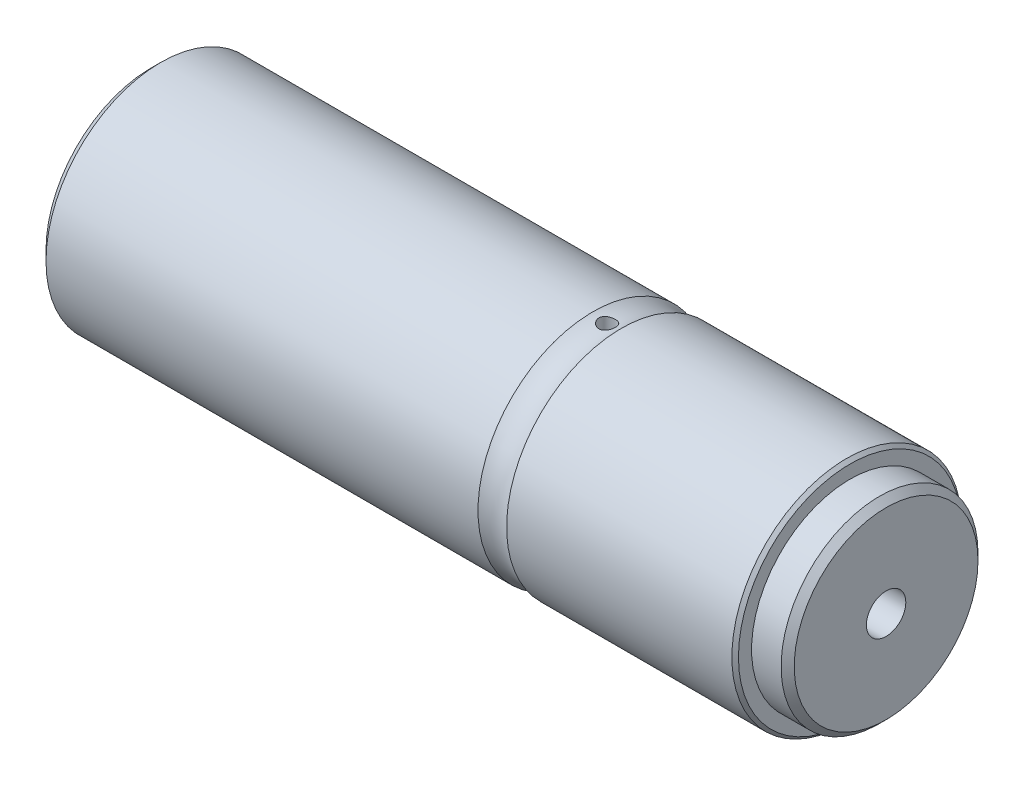
ISO-10303-21;
HEADER;
FILE_DESCRIPTION(('STEP AP214'),'2;1');
FILE_NAME('part.step','',(''),(''),'','','');
FILE_SCHEMA(('AUTOMOTIVE_DESIGN { 1 0 10303 214 1 1 1 1 }'));
ENDSEC;
DATA;
#1=APPLICATION_CONTEXT('core data for automotive mechanical design processes');
#2=APPLICATION_PROTOCOL_DEFINITION('international standard','automotive_design',2000,#1);
#3=PRODUCT_CONTEXT('',#1,'mechanical');
#4=PRODUCT('Part','Part','',(#3));
#5=PRODUCT_RELATED_PRODUCT_CATEGORY('part','',(#4));
#6=PRODUCT_DEFINITION_FORMATION('','',#4);
#7=PRODUCT_DEFINITION_CONTEXT('part definition',#1,'design');
#8=PRODUCT_DEFINITION('design','',#6,#7);
#9=PRODUCT_DEFINITION_SHAPE('','',#8);
#10=(LENGTH_UNIT() NAMED_UNIT(*) SI_UNIT(.MILLI.,.METRE.));
#11=(NAMED_UNIT(*) PLANE_ANGLE_UNIT() SI_UNIT($,.RADIAN.));
#12=(NAMED_UNIT(*) SI_UNIT($,.STERADIAN.) SOLID_ANGLE_UNIT());
#13=UNCERTAINTY_MEASURE_WITH_UNIT(LENGTH_MEASURE(1.E-05),#10,'distance_accuracy_value','');
#14=(GEOMETRIC_REPRESENTATION_CONTEXT(3) GLOBAL_UNCERTAINTY_ASSIGNED_CONTEXT((#13)) GLOBAL_UNIT_ASSIGNED_CONTEXT((#10,
#11,#12)) REPRESENTATION_CONTEXT('',''));
#15=CARTESIAN_POINT('',(0.,0.,0.));
#16=DIRECTION('',(0.,0.,1.));
#17=DIRECTION('',(1.,0.,0.));
#18=AXIS2_PLACEMENT_3D('',#15,#16,#17);
#19=CARTESIAN_POINT('',(-85.,-50.,0.));
#20=DIRECTION('',(0.,1.,0.));
#21=DIRECTION('',(0.,0.,1.));
#22=AXIS2_PLACEMENT_3D('',#19,#20,#21);
#23=CYLINDRICAL_SURFACE('',#22,2.49999999999999);
#24=CARTESIAN_POINT('',(-85.,-3.12249899919918,2.5));
#25=CARTESIAN_POINT('',(-84.9378432485545,-3.12249991555419,2.4999994109714));
#26=CARTESIAN_POINT('',(-84.8756740533292,-3.12436490733914,2.49767581942174));
#27=CARTESIAN_POINT('',(-84.7518828204523,-3.13172923119023,2.48843349840857));
#28=CARTESIAN_POINT('',(-84.6902611267429,-3.13723070381362,2.48151206248434));
#29=CARTESIAN_POINT('',(-84.5067739522563,-3.15888953558502,2.45397595058366));
#30=CARTESIAN_POINT('',(-84.386451668811,-3.1802003627114,2.4265899094646));
#31=CARTESIAN_POINT('',(-84.1544018021218,-3.23299770760365,2.35576217141198));
#32=CARTESIAN_POINT('',(-84.0426095849449,-3.26439575383207,2.31245961359202));
#33=CARTESIAN_POINT('',(-83.827991474666,-3.33366000884437,2.211439164309));
#34=CARTESIAN_POINT('',(-83.7251658262469,-3.37152639405532,2.15372087963018));
#35=CARTESIAN_POINT('',(-83.5162660186964,-3.45559225121873,2.01647682425579));
#36=CARTESIAN_POINT('',(-83.4116066749955,-3.50222814511575,1.9350642566695));
#37=CARTESIAN_POINT('',(-83.2162384483762,-3.59505503533365,1.75662526657433));
#38=CARTESIAN_POINT('',(-83.1255417200464,-3.64124561158436,1.65958538899783));
#39=CARTESIAN_POINT('',(-82.9497797018273,-3.73459524771312,1.43833990582856));
#40=CARTESIAN_POINT('',(-82.8667138155496,-3.78119887781502,1.31226934259653));
#41=CARTESIAN_POINT('',(-82.7594548452638,-3.84307251838772,1.1116339554343));
#42=CARTESIAN_POINT('',(-82.7265848616669,-3.8623628309205,1.04281240974105));
#43=CARTESIAN_POINT('',(-82.6670453146367,-3.89770436975434,0.901758767615559));
#44=CARTESIAN_POINT('',(-82.6403714689616,-3.91375783207116,0.829529068393806));
#45=CARTESIAN_POINT('',(-82.5960161847437,-3.94066759113821,0.689700297916585));
#46=CARTESIAN_POINT('',(-82.5776980234819,-3.95188535984464,0.622371981278598));
#47=CARTESIAN_POINT('',(-82.5466977136867,-3.9709624190916,0.485997575898819));
#48=CARTESIAN_POINT('',(-82.5340123107838,-3.97882364879719,0.416952503441693));
#49=CARTESIAN_POINT('',(-82.5144862023655,-3.99095470334735,0.277765449857186));
#50=CARTESIAN_POINT('',(-82.5076418834866,-3.99522674847832,0.207624174243918));
#51=CARTESIAN_POINT('',(-82.4999007866108,-4.00006125072436,0.0669114466599529));
#52=CARTESIAN_POINT('',(-82.4990033240367,-4.00062413482247,-0.00365995486026464));
#53=CARTESIAN_POINT('',(-82.5047253735473,-3.99704479619501,-0.196045081555524));
#54=CARTESIAN_POINT('',(-82.5173065030789,-3.98917040897434,-0.317681845488523));
#55=CARTESIAN_POINT('',(-82.5597302179661,-3.96290903275929,-0.55663649462024));
#56=CARTESIAN_POINT('',(-82.5895741079736,-3.94452124920476,-0.673954052677409));
#57=CARTESIAN_POINT('',(-82.6652085592833,-3.89876170711608,-0.901771991763851));
#58=CARTESIAN_POINT('',(-82.7110399195711,-3.87136697381046,-1.01225407159605));
#59=CARTESIAN_POINT('',(-82.8169372389843,-3.80971291751353,-1.22404012071222));
#60=CARTESIAN_POINT('',(-82.8770064410637,-3.77545203089317,-1.32534199174243));
#61=CARTESIAN_POINT('',(-83.0180564169237,-3.69786441247166,-1.52942649744657));
#62=CARTESIAN_POINT('',(-83.1007092766905,-3.6539400638152,-1.63082454612905));
#63=CARTESIAN_POINT('',(-83.2802647372071,-3.56390927740506,-1.81919733573061));
#64=CARTESIAN_POINT('',(-83.377188046384,-3.51779973570408,-1.90615071842623));
#65=CARTESIAN_POINT('',(-83.5974112531735,-3.42142883464465,-2.07470887167907));
#66=CARTESIAN_POINT('',(-83.7225027633581,-3.37141162686596,-2.15413229677841));
#67=CARTESIAN_POINT('',(-83.9872922373014,-3.28028278192382,-2.29052307550561));
#68=CARTESIAN_POINT('',(-84.1269626874531,-3.2391548038693,-2.34753179448502));
#69=CARTESIAN_POINT('',(-84.3795388061062,-3.18183753131763,-2.42437133527929));
#70=CARTESIAN_POINT('',(-84.4898219252135,-3.16193408602512,-2.45003683445402));
#71=CARTESIAN_POINT('',(-84.7142303775599,-3.13358277759547,-2.48620337073089));
#72=CARTESIAN_POINT('',(-84.8283502426568,-3.12511926504438,-2.49672512520809));
#73=CARTESIAN_POINT('',(-85.0574573605025,-3.12092267030677,-2.50197072095179));
#74=CARTESIAN_POINT('',(-85.1724460004784,-3.12521876170185,-2.49665835896693));
#75=CARTESIAN_POINT('',(-85.3995611643185,-3.14592085836187,-2.47051466367813));
#76=CARTESIAN_POINT('',(-85.5116852383712,-3.16233689222905,-2.44967047849125));
#77=CARTESIAN_POINT('',(-85.7284367594257,-3.20460120797142,-2.39409874195037));
#78=CARTESIAN_POINT('',(-85.8331573158943,-3.23028954367816,-2.35960571424756));
#79=CARTESIAN_POINT('',(-86.0355746998938,-3.28831148388748,-2.27804893702241));
#80=CARTESIAN_POINT('',(-86.133269018878,-3.3206474460208,-2.23098072583745));
#81=CARTESIAN_POINT('',(-86.3386119416632,-3.39574401285202,-2.11530798730693));
#82=CARTESIAN_POINT('',(-86.4446145273018,-3.43931724293015,-2.04430931160542));
#83=CARTESIAN_POINT('',(-86.6443706606543,-3.52787943213337,-1.88737868921488));
#84=CARTESIAN_POINT('',(-86.7381113212423,-3.57286982004466,-1.80143124902619));
#85=CARTESIAN_POINT('',(-86.925964070641,-3.66766209459503,-1.6007693249212));
#86=CARTESIAN_POINT('',(-87.0177273984849,-3.71707933883199,-1.48365201617176));
#87=CARTESIAN_POINT('',(-87.1801470147197,-3.80768973398605,-1.23256787407809));
#88=CARTESIAN_POINT('',(-87.2508131951269,-3.84888673619007,-1.09860897940974));
#89=CARTESIAN_POINT('',(-87.336581067975,-3.89988966499775,-0.891930804655081));
#90=CARTESIAN_POINT('',(-87.3612974439513,-3.91477055097243,-0.824318196039421));
#91=CARTESIAN_POINT('',(-87.4049382767323,-3.94124643918617,-0.686640792876425));
#92=CARTESIAN_POINT('',(-87.4238660861509,-3.95284334314803,-0.616577444051138));
#93=CARTESIAN_POINT('',(-87.4556058301392,-3.97238512039948,-0.474639231464266));
#94=CARTESIAN_POINT('',(-87.4684230995164,-3.98033317908834,-0.40276600575551));
#95=CARTESIAN_POINT('',(-87.4877391722929,-3.99234168343341,-0.257881807142462));
#96=CARTESIAN_POINT('',(-87.4942390209308,-3.99640277220023,-0.184871024482534));
#97=CARTESIAN_POINT('',(-87.5030715155071,-4.00191521492704,0.0131102774248955));
#98=CARTESIAN_POINT('',(-87.4992657929094,-3.99952706123945,0.138539079205453));
#99=CARTESIAN_POINT('',(-87.4730824104545,-3.98321975018361,0.386583137102135));
#100=CARTESIAN_POINT('',(-87.4507055933212,-3.96930111604855,0.509198520626834));
#101=CARTESIAN_POINT('',(-87.3896775844539,-3.93192083384283,0.744080605483851));
#102=CARTESIAN_POINT('',(-87.3516179264353,-3.90880701054801,0.856558752631812));
#103=CARTESIAN_POINT('',(-87.2608805375565,-3.85489971248842,1.07343034721918));
#104=CARTESIAN_POINT('',(-87.2082003404328,-3.82410494215307,1.17782242685802));
#105=CARTESIAN_POINT('',(-87.0836787212801,-3.75350673935647,1.38731297754797));
#106=CARTESIAN_POINT('',(-87.0104160092425,-3.71310001864656,1.49136012183779));
#107=CARTESIAN_POINT('',(-86.8498467674859,-3.62867283985204,1.68643334934802));
#108=CARTESIAN_POINT('',(-86.7625243911657,-3.58464833191202,1.77744451843681));
#109=CARTESIAN_POINT('',(-86.5617674849381,-3.49000828219717,1.95744716561589));
#110=CARTESIAN_POINT('',(-86.4463833874286,-3.43935738427102,2.04425661250063));
#111=CARTESIAN_POINT('',(-86.2007105902403,-3.3434964745711,2.19754648509904));
#112=CARTESIAN_POINT('',(-86.0704301888475,-3.29828346204188,2.26403815415027));
#113=CARTESIAN_POINT('',(-85.8271946992151,-3.22859539780089,2.3619822941284));
#114=CARTESIAN_POINT('',(-85.7167294278465,-3.20174639338767,2.39792458576829));
#115=CARTESIAN_POINT('',(-85.4900606569983,-3.15878358104508,2.45425618419745));
#116=CARTESIAN_POINT('',(-85.3738765802003,-3.14263581150427,2.47469472410168));
#117=CARTESIAN_POINT('',(-85.213940005354,-3.12952857640605,2.49119847139522));
#118=CARTESIAN_POINT('',(-85.1712744742914,-3.12689994306768,2.4944943383796));
#119=CARTESIAN_POINT('',(-85.0857413010483,-3.1233846193986,2.49889558125807));
#120=CARTESIAN_POINT('',(-85.0428736107567,-3.12249836712869,2.50000040629188));
#121=CARTESIAN_POINT('',(-85.,-3.12249899919918,2.5));
#122=B_SPLINE_CURVE_WITH_KNOTS('',3,(#24,#25,#26,#27,#28,#29,#30,#31,#32,#33,#34,#35,#36,#37,
#38,#39,#40,#41,#42,#43,#44,#45,#46,#47,#48,#49,#50,#51,#52,#53,#54,#55,#56,#57,#58,#59,#60,#61,
#62,#63,#64,#65,#66,#67,#68,#69,#70,#71,#72,#73,#74,#75,#76,#77,#78,#79,#80,#81,#82,#83,#84,#85,
#86,#87,#88,#89,#90,#91,#92,#93,#94,#95,#96,#97,#98,#99,#100,#101,#102,#103,#104,#105,#106,#107,
#108,#109,#110,#111,#112,#113,#114,#115,#116,#117,#118,#119,#120,#121),.UNSPECIFIED.,.T.,.F.,(4,
2,2,2,2,2,2,2,2,2,2,2,2,2,2,2,2,2,2,2,2,2,2,2,2,2,2,2,2,2,2,2,2,2,2,2,2,2,2,2,2,2,2,2,2,2,2,2,
4),(0.,0.186415315858449,0.372940459994487,0.746478880764682,1.11682668423132,1.48718459072605,
1.90722798685068,2.32763499192877,2.79876029265969,3.03445880867313,3.26999394209508,
3.48170145743205,3.69328649746503,3.90474055342594,4.11617026725866,4.48184709708113,
4.84755156693918,5.21419620193003,5.58092442797433,5.99329080205306,6.40626158573463,
6.87316206383501,7.33919680735484,7.68265621505464,8.02564530559506,8.36941921026405,
8.71347788865087,9.05186495232123,9.39037223519197,9.79332737765185,10.1967026751544,
10.6647326786671,11.1325428866818,11.3527929661038,11.5729152387446,11.7928449800803,
12.0127383271001,12.3871595324234,12.7615637480925,13.1229788842093,13.4844550226785,
13.8834503840958,14.2828986410982,14.7399238503459,15.1966956936286,15.5530255473291,
15.9082190611886,16.0367696833384,16.1653526209168),.UNSPECIFIED.);
#123=CARTESIAN_POINT('',(-85.,-3.12249899919918,2.5));
#124=VERTEX_POINT('',#123);
#125=EDGE_CURVE('E63',#124,#124,#122,.T.);
#126=ORIENTED_EDGE('',*,*,#125,.T.);
#127=EDGE_LOOP('',(#126));
#128=FACE_BOUND('',#127,.T.);
#129=CARTESIAN_POINT('',(-86.752396524481,-34.1081703536473,-1.78300498261505));
#130=CARTESIAN_POINT('',(-86.653067586052,-34.0853642041606,-1.88062742103635));
#131=CARTESIAN_POINT('',(-86.5455509224049,-34.0626600453764,-1.96995872305671));
#132=CARTESIAN_POINT('',(-86.3167783428665,-34.0199030161531,-2.12968408787526));
#133=CARTESIAN_POINT('',(-86.1955224408048,-33.9998501430455,-2.20007816973481));
#134=CARTESIAN_POINT('',(-85.9421174303636,-33.964578568251,-2.31993242926557));
#135=CARTESIAN_POINT('',(-85.8099494589765,-33.9493684680192,-2.36935541048342));
#136=CARTESIAN_POINT('',(-85.5386324546151,-33.925599513647,-2.44534362794854));
#137=CARTESIAN_POINT('',(-85.399485503669,-33.9170386882559,-2.47191563886807));
#138=CARTESIAN_POINT('',(-85.1230225967033,-33.9077457140911,-2.50071004288863));
#139=CARTESIAN_POINT('',(-84.9857942489072,-33.906768033013,-2.5036961757501));
#140=CARTESIAN_POINT('',(-84.7128476307024,-33.9121055666187,-2.48721388993134));
#141=CARTESIAN_POINT('',(-84.5771292453423,-33.9184202222582,-2.4677471925272));
#142=CARTESIAN_POINT('',(-84.3137787433715,-33.9374307822718,-2.40769348329728));
#143=CARTESIAN_POINT('',(-84.1860399660545,-33.949998447497,-2.36753035364206));
#144=CARTESIAN_POINT('',(-83.9390904397141,-33.9801180545722,-2.26764645068462));
#145=CARTESIAN_POINT('',(-83.8198811019028,-33.9976708188398,-2.20792245007401));
#146=CARTESIAN_POINT('',(-83.5890979643006,-34.0366134827962,-2.06836442791297));
#147=CARTESIAN_POINT('',(-83.4779019447045,-34.0581101973214,-1.98793601104856));
#148=CARTESIAN_POINT('',(-83.2702378197435,-34.1022878484109,-1.8101431104858));
#149=CARTESIAN_POINT('',(-83.1737737704275,-34.1249691088095,-1.71277397834874));
#150=CARTESIAN_POINT('',(-82.9945204651826,-34.1700126423905,-1.49939942930707));
#151=CARTESIAN_POINT('',(-82.9123989363277,-34.1923291851213,-1.38282175834132));
#152=CARTESIAN_POINT('',(-82.7689199451465,-34.2331340460333,-1.13689913852018));
#153=CARTESIAN_POINT('',(-82.7075602863158,-34.2516227690988,-1.00755554210873));
#154=CARTESIAN_POINT('',(-82.6083241239408,-34.2823220845045,-0.741462791805835));
#155=CARTESIAN_POINT('',(-82.5701379985504,-34.2946150633358,-0.604839078976484));
#156=CARTESIAN_POINT('',(-82.5173983591676,-34.3117537359683,-0.326665604025611));
#157=CARTESIAN_POINT('',(-82.5028363490877,-34.3166021070863,-0.185117631561379));
#158=CARTESIAN_POINT('',(-82.4980288131039,-34.3181947449711,0.0918827933370042));
#159=CARTESIAN_POINT('',(-82.5066934161375,-34.315302249972,0.227315481999155));
#160=CARTESIAN_POINT('',(-82.5457074795901,-34.3025285339949,0.494670046610562));
#161=CARTESIAN_POINT('',(-82.5760568576453,-34.2926473395615,0.62659193589267));
#162=CARTESIAN_POINT('',(-82.6571174956942,-34.2671167405513,0.882505088511226));
#163=CARTESIAN_POINT('',(-82.7077034956673,-34.2515028679328,1.00653979644676));
#164=CARTESIAN_POINT('',(-82.8276858983488,-34.2161888371144,1.24451598725644));
#165=CARTESIAN_POINT('',(-82.8970865798727,-34.1964877496439,1.35845516638569));
#166=CARTESIAN_POINT('',(-83.0562189138961,-34.1541241038181,1.57825999808723));
#167=CARTESIAN_POINT('',(-83.1466954336118,-34.1313707215904,1.68356911189599));
#168=CARTESIAN_POINT('',(-83.3438337608463,-34.0860449495929,1.87783716479805));
#169=CARTESIAN_POINT('',(-83.4504990774158,-34.063472600183,1.96679254982375));
#170=CARTESIAN_POINT('',(-83.6806300495383,-34.0203142723232,2.12827698594614));
#171=CARTESIAN_POINT('',(-83.8044824531678,-33.9998015982332,2.20027642946643));
#172=CARTESIAN_POINT('',(-84.0632711463569,-33.9638773613633,2.32228095475745));
#173=CARTESIAN_POINT('',(-84.1982048256409,-33.9484646015388,2.37229119870952));
#174=CARTESIAN_POINT('',(-84.4712911125599,-33.9249294961242,2.44743657135788));
#175=CARTESIAN_POINT('',(-84.6092427328265,-33.9166120996942,2.47323930915251));
#176=CARTESIAN_POINT('',(-84.8877496379488,-33.9075240874527,2.50139468052883));
#177=CARTESIAN_POINT('',(-85.0283042074701,-33.9067514281732,2.50375366378043));
#178=CARTESIAN_POINT('',(-85.3020635397748,-33.9127157857845,2.48532314791767));
#179=CARTESIAN_POINT('',(-85.4353380091543,-33.9191548089474,2.46545224680755));
#180=CARTESIAN_POINT('',(-85.696538065598,-33.9383543709154,2.40474862707048));
#181=CARTESIAN_POINT('',(-85.8244633402965,-33.9511152783289,2.36391468615217));
#182=CARTESIAN_POINT('',(-86.0727441249074,-33.9817422018178,2.26216414836144));
#183=CARTESIAN_POINT('',(-86.1930209780655,-33.9996532126501,2.2010697880859));
#184=CARTESIAN_POINT('',(-86.4218574293505,-34.0386821021557,2.06066822822823));
#185=CARTESIAN_POINT('',(-86.530414015903,-34.0598008017197,1.98135636387376));
#186=CARTESIAN_POINT('',(-86.7378482424947,-34.1040950189323,1.80262262911865));
#187=CARTESIAN_POINT('',(-86.8360805163259,-34.1273202417781,1.70246313411299));
#188=CARTESIAN_POINT('',(-87.0145827028685,-34.1724422306469,1.48695574291819));
#189=CARTESIAN_POINT('',(-87.094849991118,-34.1943388022303,1.37160563147263));
#190=CARTESIAN_POINT('',(-87.2362573382882,-34.2346638318538,1.12669653222244));
#191=CARTESIAN_POINT('',(-87.2970838625169,-34.2530336996208,0.996946114165817));
#192=CARTESIAN_POINT('',(-87.3958288079155,-34.2836350211506,0.728327973873629));
#193=CARTESIAN_POINT('',(-87.4337550094042,-34.2958685594742,0.589463365955095));
#194=CARTESIAN_POINT('',(-87.4842529928595,-34.3123032605442,0.312328347973635));
#195=CARTESIAN_POINT('',(-87.4977527051526,-34.3167980653974,0.174244514878348));
#196=CARTESIAN_POINT('',(-87.5017293353196,-34.3181137434551,-0.102276952719838));
#197=CARTESIAN_POINT('',(-87.4922106172401,-34.3149360712789,-0.240714515188538));
#198=CARTESIAN_POINT('',(-87.4512233285856,-34.3015314468107,-0.509272435464886));
#199=CARTESIAN_POINT('',(-87.4204818211337,-34.2915381224121,-0.639516764320789));
#200=CARTESIAN_POINT('',(-87.3388841701878,-34.2658780744014,-0.892943793844475));
#201=CARTESIAN_POINT('',(-87.2880254081461,-34.2502106122417,-1.01612557282984));
#202=CARTESIAN_POINT('',(-87.1666160626764,-34.2145501312499,-1.25459579461915));
#203=CARTESIAN_POINT('',(-87.0957185510069,-34.1944824442458,-1.36969602660149));
#204=CARTESIAN_POINT('',(-86.9365594488903,-34.152301913875,-1.58677723312002));
#205=CARTESIAN_POINT('',(-86.8482938677215,-34.1301886010977,-1.68875518358029));
#206=CARTESIAN_POINT('',(-86.752396524481,-34.1081703536473,-1.78300498261505));
#207=B_SPLINE_CURVE_WITH_KNOTS('',3,(#129,#130,#131,#132,#133,#134,#135,#136,#137,#138,#139,
#140,#141,#142,#143,#144,#145,#146,#147,#148,#149,#150,#151,#152,#153,#154,#155,#156,#157,#158,
#159,#160,#161,#162,#163,#164,#165,#166,#167,#168,#169,#170,#171,#172,#173,#174,#175,#176,#177,
#178,#179,#180,#181,#182,#183,#184,#185,#186,#187,#188,#189,#190,#191,#192,#193,#194,#195,#196,
#197,#198,#199,#200,#201,#202,#203,#204,#205,#206),.UNSPECIFIED.,.T.,.F.,(4,2,2,2,2,2,2,2,2,2,2,
2,2,2,2,2,2,2,2,2,2,2,2,2,2,2,2,2,2,2,2,2,2,2,2,2,2,2,4),(0.,0.42291264623028,0.845824866773706,
1.26948410276424,1.69301769232097,2.10277813000338,2.5125071567695,2.91415970800312,
3.31587856048639,3.73074998178015,4.1457354215564,4.57666364305437,5.00754626018539,
5.43253726300112,5.85737538975028,6.26263165079054,6.66788637258209,7.07067054100775,
7.4735463871443,7.89371665732941,8.31397813318541,8.74600554054653,9.17793147099349,
9.59756145228199,10.0170777749626,10.419878617711,10.8227029492246,11.2291595092274,
11.6357202627108,12.0603663244647,12.4850743813182,12.9163217461479,13.3474225133669,
13.7617720529783,14.1760430425357,14.5767834358178,14.9775760083523,15.3857840526525,
15.794086002092),.UNSPECIFIED.);
#208=CARTESIAN_POINT('',(-86.752396524481,-34.1081703536473,-1.78300498261505));
#209=VERTEX_POINT('',#208);
#210=EDGE_CURVE('E74',#209,#209,#207,.T.);
#211=ORIENTED_EDGE('',*,*,#210,.T.);
#212=EDGE_LOOP('',(#211));
#213=FACE_BOUND('',#212,.T.);
#214=ADVANCED_FACE('F38',(#128,#213),#23,.F.);
#215=CARTESIAN_POINT('',(-224.,35.,0.));
#216=DIRECTION('',(-1.,0.,0.));
#217=DIRECTION('',(0.,0.,1.));
#218=AXIS2_PLACEMENT_3D('',#215,#216,#217);
#219=PLANE('',#218);
#220=CARTESIAN_POINT('',(-224.,0.,0.));
#221=DIRECTION('',(-1.,0.,0.));
#222=DIRECTION('',(0.,0.,1.));
#223=AXIS2_PLACEMENT_3D('',#220,#221,#222);
#224=CIRCLE('',#223,32.);
#225=CARTESIAN_POINT('',(-224.,0.,32.));
#226=VERTEX_POINT('',#225);
#227=EDGE_CURVE('E83',#226,#226,#224,.T.);
#228=ORIENTED_EDGE('',*,*,#227,.T.);
#229=EDGE_LOOP('',(#228));
#230=FACE_BOUND('',#229,.T.);
#231=ADVANCED_FACE('F142',(#230),#219,.T.);
#232=CARTESIAN_POINT('',(0.,0.,0.));
#233=DIRECTION('',(1.,0.,0.));
#234=DIRECTION('',(0.,0.,-1.));
#235=AXIS2_PLACEMENT_3D('',#232,#233,#234);
#236=CYLINDRICAL_SURFACE('',#235,35.);
#237=CARTESIAN_POINT('',(-221.,0.,0.));
#238=DIRECTION('',(-1.,0.,0.));
#239=DIRECTION('',(0.,0.,1.));
#240=AXIS2_PLACEMENT_3D('',#237,#238,#239);
#241=CIRCLE('',#240,35.);
#242=CARTESIAN_POINT('',(-221.,0.,35.));
#243=VERTEX_POINT('',#242);
#244=EDGE_CURVE('E80',#243,#243,#241,.F.);
#245=ORIENTED_EDGE('',*,*,#244,.T.);
#246=EDGE_LOOP('',(#245));
#247=FACE_BOUND('',#246,.T.);
#248=CARTESIAN_POINT('',(-89.3588989435407,0.,0.));
#249=DIRECTION('',(1.,0.,0.));
#250=DIRECTION('',(0.,0.,-1.));
#251=AXIS2_PLACEMENT_3D('',#248,#249,#250);
#252=CIRCLE('',#251,35.);
#253=CARTESIAN_POINT('',(-89.3588989435407,0.,-35.));
#254=VERTEX_POINT('',#253);
#255=EDGE_CURVE('E77',#254,#254,#252,.T.);
#256=ORIENTED_EDGE('',*,*,#255,.F.);
#257=EDGE_LOOP('',(#256));
#258=FACE_BOUND('',#257,.T.);
#259=ADVANCED_FACE('F147',(#247,#258),#236,.T.);
#260=CARTESIAN_POINT('',(-85.,0.,0.));
#261=DIRECTION('',(1.,0.,0.));
#262=DIRECTION('',(0.,0.,-1.));
#263=AXIS2_PLACEMENT_3D('',#260,#261,#262);
#264=TOROIDAL_SURFACE('',#263,44.,10.);
#265=ORIENTED_EDGE('',*,*,#210,.F.);
#266=EDGE_LOOP('',(#265));
#267=FACE_BOUND('',#266,.T.);
#268=CARTESIAN_POINT('',(-86.752396524481,34.1081703536473,-1.78300498261505));
#269=CARTESIAN_POINT('',(-86.8519795821211,34.1310352424582,-1.68513013997717));
#270=CARTESIAN_POINT('',(-86.9433486733167,34.1540059912927,-1.57890578091366));
#271=CARTESIAN_POINT('',(-87.1072788197374,34.1976529072119,-1.35237668797553));
#272=CARTESIAN_POINT('',(-87.179838827174,34.2183289464296,-1.23207117023031));
#273=CARTESIAN_POINT('',(-87.3041231755078,34.2550714166454,-0.98018667882236));
#274=CARTESIAN_POINT('',(-87.3558109306437,34.2711297394581,-0.848588395927944));
#275=CARTESIAN_POINT('',(-87.4363599195915,34.2966401613018,-0.577980408089227));
#276=CARTESIAN_POINT('',(-87.4652288589723,34.3060944902762,-0.438973221959665));
#277=CARTESIAN_POINT('',(-87.4984707300894,34.3170170583494,-0.162448719553676));
#278=CARTESIAN_POINT('',(-87.5036258235058,34.318740247615,-0.0250354040390488));
#279=CARTESIAN_POINT('',(-87.4913709444467,34.3146875756419,0.248658499425027));
#280=CARTESIAN_POINT('',(-87.4739630238126,34.3089123962917,0.38493918923931));
#281=CARTESIAN_POINT('',(-87.4179253397142,34.2907837116161,0.649197244065423));
#282=CARTESIAN_POINT('',(-87.3798058829189,34.2785886016057,0.777294645595358));
#283=CARTESIAN_POINT('',(-87.2839570275322,34.2490746990763,1.02529114096496));
#284=CARTESIAN_POINT('',(-87.2262242899403,34.2317550342086,1.14518883469361));
#285=CARTESIAN_POINT('',(-87.0906114112488,34.193183314753,1.37769610958868));
#286=CARTESIAN_POINT('',(-87.012133065048,34.171820999606,1.48993813005131));
#287=CARTESIAN_POINT('',(-86.8380848858574,34.1278289175317,1.7000182545097));
#288=CARTESIAN_POINT('',(-86.7425104342639,34.1051988092409,1.79785245310096));
#289=CARTESIAN_POINT('',(-86.5324039174785,34.06012117802,1.98037007547032));
#290=CARTESIAN_POINT('',(-86.4172643778168,34.0377175360961,2.06436704997883));
#291=CARTESIAN_POINT('',(-86.1739034380001,33.9965920717882,2.21182861340204));
#292=CARTESIAN_POINT('',(-86.0456831823951,33.9778699276956,2.27529499670053));
#293=CARTESIAN_POINT('',(-85.7812579763116,33.9464754305325,2.3789814399346));
#294=CARTESIAN_POINT('',(-85.6451686322504,33.9337325056471,2.41947391673497));
#295=CARTESIAN_POINT('',(-85.3676468713891,33.915485592202,2.47687214600041));
#296=CARTESIAN_POINT('',(-85.2262162866099,33.9099791443502,2.49378591172947));
#297=CARTESIAN_POINT('',(-84.9487945137859,33.9069405739899,2.50315419862596));
#298=CARTESIAN_POINT('',(-84.8128417012692,33.9090641207953,2.49666482001524));
#299=CARTESIAN_POINT('',(-84.5440776102787,33.9202813192204,2.46180744755648));
#300=CARTESIAN_POINT('',(-84.4112662344939,33.9293747546444,2.43344013232959));
#301=CARTESIAN_POINT('',(-84.1535935838464,33.9534216844053,2.35617090024048));
#302=CARTESIAN_POINT('',(-84.0286742758655,33.968324655351,2.307445772325));
#303=CARTESIAN_POINT('',(-83.7886691110593,34.0024362852183,2.19099952725368));
#304=CARTESIAN_POINT('',(-83.6735853104215,34.0216458414379,2.12327445062653));
#305=CARTESIAN_POINT('',(-83.4515983489348,34.0632556789205,1.96762504199518));
#306=CARTESIAN_POINT('',(-83.3451995470516,34.0857521830423,1.87900707829082));
#307=CARTESIAN_POINT('',(-83.1484499017031,34.1309463816153,1.68547125875876));
#308=CARTESIAN_POINT('',(-83.058102976698,34.1536441237754,1.58054943464441));
#309=CARTESIAN_POINT('',(-82.8932524411168,34.1974866755426,1.35347419185023));
#310=CARTESIAN_POINT('',(-82.8193219448116,34.2185622009267,1.23088985815797));
#311=CARTESIAN_POINT('',(-82.6932389087483,34.2558666261381,0.974306258332475));
#312=CARTESIAN_POINT('',(-82.6410816157447,34.2720965835669,0.840309491313458));
#313=CARTESIAN_POINT('',(-82.5614195145919,34.2973618802443,0.568242283658947));
#314=CARTESIAN_POINT('',(-82.5333214021625,34.3065697179736,0.43036215008549));
#315=CARTESIAN_POINT('',(-82.5006578104043,34.3173046400563,0.151563572604622));
#316=CARTESIAN_POINT('',(-82.4960851299696,34.3188340747559,0.0106460716960703));
#317=CARTESIAN_POINT('',(-82.5103213122804,34.3141297258023,-0.263745007801135));
#318=CARTESIAN_POINT('',(-82.5281308611346,34.3082277168934,-0.397277636661777));
#319=CARTESIAN_POINT('',(-82.5847857239626,34.2899143654494,-0.659328106419405));
#320=CARTESIAN_POINT('',(-82.6236323258115,34.277502624394,-0.787845639778969));
#321=CARTESIAN_POINT('',(-82.7214022687451,34.2474542368634,-1.03733872868364));
#322=CARTESIAN_POINT('',(-82.7804600806073,34.2297827008488,-1.15825717718178));
#323=CARTESIAN_POINT('',(-82.916872617385,34.1911346417428,-1.38871241302788));
#324=CARTESIAN_POINT('',(-82.9942320259991,34.1701572730906,-1.49824627651622));
#325=CARTESIAN_POINT('',(-83.1692438806715,34.1260371246578,-1.70817234557988));
#326=CARTESIAN_POINT('',(-83.2676665154891,34.1028391169188,-1.80791167532594));
#327=CARTESIAN_POINT('',(-83.4799432418108,34.0576716979046,-1.98971359713962));
#328=CARTESIAN_POINT('',(-83.5937996021631,34.035702467939,-2.07177358563903));
#329=CARTESIAN_POINT('',(-83.8361664514628,33.9950500501771,-2.21715761188376));
#330=CARTESIAN_POINT('',(-83.964891906829,33.9764286078218,-2.28014191290709));
#331=CARTESIAN_POINT('',(-84.2318363519293,33.9451222362995,-2.38335581269326));
#332=CARTESIAN_POINT('',(-84.3700524010542,33.9324354777364,-2.42359242434444));
#333=CARTESIAN_POINT('',(-84.6465950866072,33.9148723234155,-2.47875863770587));
#334=CARTESIAN_POINT('',(-84.7847286668257,33.9097244808198,-2.49456896759335));
#335=CARTESIAN_POINT('',(-85.0617678403981,33.9069672714761,-2.50307414501658));
#336=CARTESIAN_POINT('',(-85.2006732773241,33.9093564291458,-2.49577351717939));
#337=CARTESIAN_POINT('',(-85.4705170562985,33.9211872876569,-2.45897404963779));
#338=CARTESIAN_POINT('',(-85.601567277927,33.9303950877641,-2.43021118750449));
#339=CARTESIAN_POINT('',(-85.8569034033028,33.9545949892825,-2.35234704767904));
#340=CARTESIAN_POINT('',(-85.9811887387532,33.9695875758022,-2.3032440642513));
#341=CARTESIAN_POINT('',(-86.2209696887289,34.003957791034,-2.18568674121637));
#342=CARTESIAN_POINT('',(-86.3363762179801,34.0233736373861,-2.11706236636355));
#343=CARTESIAN_POINT('',(-86.55449161628,34.0645504817267,-1.96250662669942));
#344=CARTESIAN_POINT('',(-86.6571974097526,34.0863120453693,-1.87657108305536));
#345=CARTESIAN_POINT('',(-86.752396524481,34.1081703536473,-1.78300498261505));
#346=B_SPLINE_CURVE_WITH_KNOTS('',3,(#268,#269,#270,#271,#272,#273,#274,#275,#276,#277,#278,
#279,#280,#281,#282,#283,#284,#285,#286,#287,#288,#289,#290,#291,#292,#293,#294,#295,#296,#297,
#298,#299,#300,#301,#302,#303,#304,#305,#306,#307,#308,#309,#310,#311,#312,#313,#314,#315,#316,
#317,#318,#319,#320,#321,#322,#323,#324,#325,#326,#327,#328,#329,#330,#331,#332,#333,#334,#335,
#336,#337,#338,#339,#340,#341,#342,#343,#344,#345),.UNSPECIFIED.,.T.,.F.,(4,2,2,2,2,2,2,2,2,2,2,
2,2,2,2,2,2,2,2,2,2,2,2,2,2,2,2,2,2,2,2,2,2,2,2,2,2,2,4),(0.,0.42400233721482,0.848028289047682,
1.27279429838863,1.69741680932123,2.10792841121705,2.51840268451982,2.91919394241592,
3.32005346596152,3.73404847778877,4.14815550195051,4.57890340449198,5.00961364927683,
5.43510379934836,5.86044931060649,6.26684550014014,6.67322908437388,7.07615463196144,
7.47916420918305,7.89813147005658,8.31720086587709,8.74916650835898,9.18103780028397,
9.60192423139426,10.0226818220135,10.4253035956687,10.8279500203606,11.2333291930245,
11.6388122217468,12.0629598293378,12.4871698568748,12.9185423674896,13.3497818175916,
13.7650759767339,14.1802888352656,14.5818823107902,14.9835094710209,15.3887480218976,
15.7940845128849),.UNSPECIFIED.);
#347=CARTESIAN_POINT('',(-86.752396524481,34.1081703536473,-1.78300498261505));
#348=VERTEX_POINT('',#347);
#349=EDGE_CURVE('E94',#348,#348,#346,.T.);
#350=ORIENTED_EDGE('',*,*,#349,.F.);
#351=EDGE_LOOP('',(#350));
#352=FACE_BOUND('',#351,.T.);
#353=ORIENTED_EDGE('',*,*,#255,.T.);
#354=EDGE_LOOP('',(#353));
#355=FACE_BOUND('',#354,.T.);
#356=CARTESIAN_POINT('',(-80.6411010564593,0.,0.));
#357=DIRECTION('',(1.,0.,0.));
#358=DIRECTION('',(0.,0.,-1.));
#359=AXIS2_PLACEMENT_3D('',#356,#357,#358);
#360=CIRCLE('',#359,35.);
#361=CARTESIAN_POINT('',(-80.6411010564593,0.,-35.));
#362=VERTEX_POINT('',#361);
#363=EDGE_CURVE('E73',#362,#362,#360,.T.);
#364=ORIENTED_EDGE('',*,*,#363,.F.);
#365=EDGE_LOOP('',(#364));
#366=FACE_BOUND('',#365,.T.);
#367=ADVANCED_FACE('F105',(#267,#352,#355,#366),#264,.F.);
#368=CARTESIAN_POINT('',(0.,0.,0.));
#369=DIRECTION('',(1.,0.,0.));
#370=DIRECTION('',(0.,0.,-1.));
#371=AXIS2_PLACEMENT_3D('',#368,#369,#370);
#372=CYLINDRICAL_SURFACE('',#371,35.);
#373=CARTESIAN_POINT('',(-12.0000000000001,0.,0.));
#374=DIRECTION('',(1.,0.,0.));
#375=DIRECTION('',(0.,0.,-1.));
#376=AXIS2_PLACEMENT_3D('',#373,#374,#375);
#377=CIRCLE('',#376,35.);
#378=CARTESIAN_POINT('',(-12.0000000000001,0.,-35.));
#379=VERTEX_POINT('',#378);
#380=EDGE_CURVE('E11',#379,#379,#377,.F.);
#381=ORIENTED_EDGE('',*,*,#380,.T.);
#382=EDGE_LOOP('',(#381));
#383=FACE_BOUND('',#382,.T.);
#384=ORIENTED_EDGE('',*,*,#363,.T.);
#385=EDGE_LOOP('',(#384));
#386=FACE_BOUND('',#385,.T.);
#387=ADVANCED_FACE('F158',(#383,#386),#372,.T.);
#388=CARTESIAN_POINT('',(-11.,30.,0.));
#389=DIRECTION('',(1.,0.,0.));
#390=DIRECTION('',(0.,0.,-1.));
#391=AXIS2_PLACEMENT_3D('',#388,#389,#390);
#392=PLANE('',#391);
#393=CARTESIAN_POINT('',(-11.,0.,0.));
#394=DIRECTION('',(1.,0.,0.));
#395=DIRECTION('',(0.,0.,-1.));
#396=AXIS2_PLACEMENT_3D('',#393,#394,#395);
#397=CIRCLE('',#396,34.);
#398=CARTESIAN_POINT('',(-11.,0.,-34.));
#399=VERTEX_POINT('',#398);
#400=EDGE_CURVE('E46',#399,#399,#397,.T.);
#401=ORIENTED_EDGE('',*,*,#400,.T.);
#402=EDGE_LOOP('',(#401));
#403=FACE_BOUND('',#402,.T.);
#404=CARTESIAN_POINT('',(-11.,0.,0.));
#405=DIRECTION('',(1.,0.,0.));
#406=DIRECTION('',(0.,0.,-1.));
#407=AXIS2_PLACEMENT_3D('',#404,#405,#406);
#408=CIRCLE('',#407,30.);
#409=CARTESIAN_POINT('',(-11.,0.,-30.));
#410=VERTEX_POINT('',#409);
#411=EDGE_CURVE('E70',#410,#410,#408,.T.);
#412=ORIENTED_EDGE('',*,*,#411,.F.);
#413=EDGE_LOOP('',(#412));
#414=FACE_BOUND('',#413,.T.);
#415=ADVANCED_FACE('F166',(#403,#414),#392,.T.);
#416=CARTESIAN_POINT('',(0.,0.,0.));
#417=DIRECTION('',(1.,0.,0.));
#418=DIRECTION('',(0.,0.,-1.));
#419=AXIS2_PLACEMENT_3D('',#416,#417,#418);
#420=CYLINDRICAL_SURFACE('',#419,30.);
#421=CARTESIAN_POINT('',(-2.00000000000006,0.,0.));
#422=DIRECTION('',(1.,0.,0.));
#423=DIRECTION('',(0.,0.,-1.));
#424=AXIS2_PLACEMENT_3D('',#421,#422,#423);
#425=CIRCLE('',#424,30.);
#426=CARTESIAN_POINT('',(-2.00000000000006,0.,-30.));
#427=VERTEX_POINT('',#426);
#428=EDGE_CURVE('E89',#427,#427,#425,.F.);
#429=ORIENTED_EDGE('',*,*,#428,.T.);
#430=EDGE_LOOP('',(#429));
#431=FACE_BOUND('',#430,.T.);
#432=ORIENTED_EDGE('',*,*,#411,.T.);
#433=EDGE_LOOP('',(#432));
#434=FACE_BOUND('',#433,.T.);
#435=ADVANCED_FACE('F171',(#431,#434),#420,.T.);
#436=CARTESIAN_POINT('',(0.,0.,0.));
#437=DIRECTION('',(1.,0.,0.));
#438=DIRECTION('',(0.,0.,-1.));
#439=AXIS2_PLACEMENT_3D('',#436,#437,#438);
#440=PLANE('',#439);
#441=CARTESIAN_POINT('',(0.,0.,0.));
#442=DIRECTION('',(1.,0.,0.));
#443=DIRECTION('',(0.,0.,-1.));
#444=AXIS2_PLACEMENT_3D('',#441,#442,#443);
#445=CIRCLE('',#444,6.);
#446=CARTESIAN_POINT('',(0.,0.,-6.));
#447=VERTEX_POINT('',#446);
#448=EDGE_CURVE('E299',#447,#447,#445,.T.);
#449=ORIENTED_EDGE('',*,*,#448,.F.);
#450=EDGE_LOOP('',(#449));
#451=FACE_BOUND('',#450,.T.);
#452=CARTESIAN_POINT('',(0.,0.,0.));
#453=DIRECTION('',(1.,0.,0.));
#454=DIRECTION('',(0.,0.,-1.));
#455=AXIS2_PLACEMENT_3D('',#452,#453,#454);
#456=CIRCLE('',#455,28.);
#457=CARTESIAN_POINT('',(0.,0.,-28.));
#458=VERTEX_POINT('',#457);
#459=EDGE_CURVE('E86',#458,#458,#456,.T.);
#460=ORIENTED_EDGE('',*,*,#459,.T.);
#461=EDGE_LOOP('',(#460));
#462=FACE_BOUND('',#461,.T.);
#463=ADVANCED_FACE('F115',(#451,#462),#440,.T.);
#464=CARTESIAN_POINT('',(-221.,0.,0.));
#465=DIRECTION('',(1.,0.,0.));
#466=DIRECTION('',(0.,0.,-1.));
#467=AXIS2_PLACEMENT_3D('',#464,#465,#466);
#468=CONICAL_SURFACE('',#467,35.,0.785398163397451);
#469=ORIENTED_EDGE('',*,*,#227,.F.);
#470=EDGE_LOOP('',(#469));
#471=FACE_BOUND('',#470,.T.);
#472=ORIENTED_EDGE('',*,*,#244,.F.);
#473=EDGE_LOOP('',(#472));
#474=FACE_BOUND('',#473,.T.);
#475=ADVANCED_FACE('F179',(#471,#474),#468,.T.);
#476=CARTESIAN_POINT('',(0.,0.,0.));
#477=DIRECTION('',(-1.,0.,0.));
#478=DIRECTION('',(0.,0.,1.));
#479=AXIS2_PLACEMENT_3D('',#476,#477,#478);
#480=CONICAL_SURFACE('',#479,28.,0.785398163397442);
#481=ORIENTED_EDGE('',*,*,#428,.F.);
#482=EDGE_LOOP('',(#481));
#483=FACE_BOUND('',#482,.T.);
#484=ORIENTED_EDGE('',*,*,#459,.F.);
#485=EDGE_LOOP('',(#484));
#486=FACE_BOUND('',#485,.T.);
#487=ADVANCED_FACE('F186',(#483,#486),#480,.T.);
#488=CARTESIAN_POINT('',(-11.,0.,0.));
#489=DIRECTION('',(-1.,0.,0.));
#490=DIRECTION('',(0.,0.,1.));
#491=AXIS2_PLACEMENT_3D('',#488,#489,#490);
#492=CONICAL_SURFACE('',#491,34.,0.785398163397435);
#493=ORIENTED_EDGE('',*,*,#380,.F.);
#494=EDGE_LOOP('',(#493));
#495=FACE_BOUND('',#494,.T.);
#496=ORIENTED_EDGE('',*,*,#400,.F.);
#497=EDGE_LOOP('',(#496));
#498=FACE_BOUND('',#497,.T.);
#499=ADVANCED_FACE('F40',(#495,#498),#492,.T.);
#500=CARTESIAN_POINT('',(-85.,3.12249899919918,2.5));
#501=CARTESIAN_POINT('',(-85.0621567514455,3.12249991555419,2.4999994109714));
#502=CARTESIAN_POINT('',(-85.1243259466708,3.12436490733914,2.49767581942174));
#503=CARTESIAN_POINT('',(-85.2481171795477,3.13172923119023,2.48843349840857));
#504=CARTESIAN_POINT('',(-85.3097388732571,3.13723070381362,2.48151206248434));
#505=CARTESIAN_POINT('',(-85.4932260477437,3.15888953558502,2.45397595058366));
#506=CARTESIAN_POINT('',(-85.613548331189,3.1802003627114,2.4265899094646));
#507=CARTESIAN_POINT('',(-85.8455981978782,3.23299770760365,2.35576217141198));
#508=CARTESIAN_POINT('',(-85.9573904150551,3.26439575383207,2.31245961359202));
#509=CARTESIAN_POINT('',(-86.1720085253341,3.33366000884438,2.21143916430899));
#510=CARTESIAN_POINT('',(-86.2748341737531,3.37152639405532,2.15372087963018));
#511=CARTESIAN_POINT('',(-86.4837339813037,3.45559225121873,2.01647682425579));
#512=CARTESIAN_POINT('',(-86.5883933250045,3.50222814511575,1.9350642566695));
#513=CARTESIAN_POINT('',(-86.7837615516238,3.59505503533365,1.75662526657433));
#514=CARTESIAN_POINT('',(-86.8744582799536,3.64124561158436,1.65958538899783));
#515=CARTESIAN_POINT('',(-87.0502202981727,3.73459524771312,1.43833990582856));
#516=CARTESIAN_POINT('',(-87.1332861844504,3.78119887781502,1.31226934259653));
#517=CARTESIAN_POINT('',(-87.2405451547362,3.84307251838772,1.1116339554343));
#518=CARTESIAN_POINT('',(-87.2734151383331,3.8623628309205,1.04281240974105));
#519=CARTESIAN_POINT('',(-87.3329546853633,3.89770436975434,0.901758767615559));
#520=CARTESIAN_POINT('',(-87.3596285310384,3.91375783207116,0.829529068393806));
#521=CARTESIAN_POINT('',(-87.4039838152563,3.94066759113821,0.689700297916585));
#522=CARTESIAN_POINT('',(-87.4223019765181,3.95188535984464,0.622371981278598));
#523=CARTESIAN_POINT('',(-87.4533022863134,3.9709624190916,0.485997575898819));
#524=CARTESIAN_POINT('',(-87.4659876892162,3.97882364879719,0.416952503441693));
#525=CARTESIAN_POINT('',(-87.4855137976345,3.99095470334735,0.277765449857186));
#526=CARTESIAN_POINT('',(-87.4923581165134,3.99522674847832,0.207624174243919));
#527=CARTESIAN_POINT('',(-87.5000992133892,4.00006125072436,0.0669114466599529));
#528=CARTESIAN_POINT('',(-87.5009966759633,4.00062413482247,-0.00365995486026461));
#529=CARTESIAN_POINT('',(-87.4952746264528,3.99704479619501,-0.196045081555523));
#530=CARTESIAN_POINT('',(-87.4826934969211,3.98917040897434,-0.317681845488521));
#531=CARTESIAN_POINT('',(-87.4402697820339,3.96290903275929,-0.556636494620239));
#532=CARTESIAN_POINT('',(-87.4104258920264,3.94452124920476,-0.673954052677408));
#533=CARTESIAN_POINT('',(-87.3347914407167,3.89876170711608,-0.901771991763851));
#534=CARTESIAN_POINT('',(-87.2889600804289,3.87136697381046,-1.01225407159605));
#535=CARTESIAN_POINT('',(-87.1830627610157,3.80971291751353,-1.22404012071222));
#536=CARTESIAN_POINT('',(-87.1229935589364,3.77545203089317,-1.32534199174243));
#537=CARTESIAN_POINT('',(-86.9819435830763,3.69786441247166,-1.52942649744657));
#538=CARTESIAN_POINT('',(-86.8992907233095,3.6539400638152,-1.63082454612905));
#539=CARTESIAN_POINT('',(-86.7197352627929,3.56390927740506,-1.81919733573061));
#540=CARTESIAN_POINT('',(-86.622811953616,3.51779973570408,-1.90615071842623));
#541=CARTESIAN_POINT('',(-86.4025887468265,3.42142883464465,-2.07470887167907));
#542=CARTESIAN_POINT('',(-86.2774972366419,3.37141162686596,-2.15413229677841));
#543=CARTESIAN_POINT('',(-86.0127077626986,3.28028278192382,-2.29052307550561));
#544=CARTESIAN_POINT('',(-85.8730373125469,3.2391548038693,-2.34753179448502));
#545=CARTESIAN_POINT('',(-85.6204611938938,3.18183753131763,-2.42437133527929));
#546=CARTESIAN_POINT('',(-85.5101780747865,3.16193408602512,-2.45003683445402));
#547=CARTESIAN_POINT('',(-85.2857696224401,3.13358277759547,-2.48620337073089));
#548=CARTESIAN_POINT('',(-85.1716497573432,3.12511926504438,-2.49672512520809));
#549=CARTESIAN_POINT('',(-84.9425426394976,3.12092267030677,-2.50197072095179));
#550=CARTESIAN_POINT('',(-84.8275539995216,3.12521876170185,-2.49665835896693));
#551=CARTESIAN_POINT('',(-84.6004388356815,3.14592085836187,-2.47051466367813));
#552=CARTESIAN_POINT('',(-84.4883147616288,3.16233689222905,-2.44967047849125));
#553=CARTESIAN_POINT('',(-84.2715632405743,3.20460120797142,-2.39409874195037));
#554=CARTESIAN_POINT('',(-84.1668426841057,3.23028954367816,-2.35960571424756));
#555=CARTESIAN_POINT('',(-83.9644253001062,3.28831148388748,-2.27804893702242));
#556=CARTESIAN_POINT('',(-83.8667309811221,3.3206474460208,-2.23098072583745));
#557=CARTESIAN_POINT('',(-83.6613880583368,3.39574401285202,-2.11530798730693));
#558=CARTESIAN_POINT('',(-83.5553854726982,3.43931724293014,-2.04430931160543));
#559=CARTESIAN_POINT('',(-83.3556293393458,3.52787943213337,-1.88737868921489));
#560=CARTESIAN_POINT('',(-83.2618886787577,3.57286982004466,-1.80143124902619));
#561=CARTESIAN_POINT('',(-83.0740359293591,3.66766209459503,-1.6007693249212));
#562=CARTESIAN_POINT('',(-82.9822726015151,3.71707933883199,-1.48365201617176));
#563=CARTESIAN_POINT('',(-82.8198529852803,3.80768973398605,-1.23256787407809));
#564=CARTESIAN_POINT('',(-82.7491868048731,3.84888673619007,-1.09860897940974));
#565=CARTESIAN_POINT('',(-82.663418932025,3.89988966499775,-0.89193080465508));
#566=CARTESIAN_POINT('',(-82.6387025560487,3.91477055097243,-0.82431819603942));
#567=CARTESIAN_POINT('',(-82.5950617232677,3.94124643918617,-0.686640792876422));
#568=CARTESIAN_POINT('',(-82.5761339138491,3.95284334314803,-0.616577444051133));
#569=CARTESIAN_POINT('',(-82.5443941698608,3.97238512039948,-0.474639231464261));
#570=CARTESIAN_POINT('',(-82.5315769004836,3.98033317908835,-0.402766005755505));
#571=CARTESIAN_POINT('',(-82.5122608277071,3.99234168343341,-0.25788180714246));
#572=CARTESIAN_POINT('',(-82.5057609790692,3.99640277220023,-0.184871024482533));
#573=CARTESIAN_POINT('',(-82.4969284844929,4.00191521492704,0.0131102774248956));
#574=CARTESIAN_POINT('',(-82.5007342070906,3.99952706123945,0.138539079205453));
#575=CARTESIAN_POINT('',(-82.5269175895455,3.98321975018361,0.386583137102135));
#576=CARTESIAN_POINT('',(-82.5492944066788,3.96930111604855,0.509198520626834));
#577=CARTESIAN_POINT('',(-82.6103224155461,3.93192083384283,0.744080605483851));
#578=CARTESIAN_POINT('',(-82.6483820735647,3.90880701054801,0.856558752631812));
#579=CARTESIAN_POINT('',(-82.7391194624435,3.85489971248842,1.07343034721918));
#580=CARTESIAN_POINT('',(-82.7917996595672,3.82410494215307,1.17782242685802));
#581=CARTESIAN_POINT('',(-82.9163212787199,3.75350673935647,1.38731297754797));
#582=CARTESIAN_POINT('',(-82.9895839907575,3.71310001864656,1.49136012183779));
#583=CARTESIAN_POINT('',(-83.1501532325141,3.62867283985204,1.68643334934802));
#584=CARTESIAN_POINT('',(-83.2374756088343,3.58464833191202,1.77744451843681));
#585=CARTESIAN_POINT('',(-83.4382325150619,3.49000828219717,1.95744716561589));
#586=CARTESIAN_POINT('',(-83.5536166125714,3.43935738427103,2.04425661250063));
#587=CARTESIAN_POINT('',(-83.7992894097598,3.3434964745711,2.19754648509904));
#588=CARTESIAN_POINT('',(-83.9295698111525,3.29828346204188,2.26403815415027));
#589=CARTESIAN_POINT('',(-84.1728053007849,3.22859539780089,2.3619822941284));
#590=CARTESIAN_POINT('',(-84.2832705721535,3.20174639338767,2.39792458576829));
#591=CARTESIAN_POINT('',(-84.5099393430017,3.15878358104508,2.45425618419745));
#592=CARTESIAN_POINT('',(-84.6261234197997,3.14263581150427,2.47469472410168));
#593=CARTESIAN_POINT('',(-84.7860599946461,3.12952857640605,2.49119847139522));
#594=CARTESIAN_POINT('',(-84.8287255257086,3.12689994306768,2.4944943383796));
#595=CARTESIAN_POINT('',(-84.9142586989517,3.1233846193986,2.49889558125807));
#596=CARTESIAN_POINT('',(-84.9571263892434,3.12249836712869,2.50000040629188));
#597=CARTESIAN_POINT('',(-85.,3.12249899919918,2.5));
#598=B_SPLINE_CURVE_WITH_KNOTS('',3,(#500,#501,#502,#503,#504,#505,#506,#507,#508,#509,#510,
#511,#512,#513,#514,#515,#516,#517,#518,#519,#520,#521,#522,#523,#524,#525,#526,#527,#528,#529,
#530,#531,#532,#533,#534,#535,#536,#537,#538,#539,#540,#541,#542,#543,#544,#545,#546,#547,#548,
#549,#550,#551,#552,#553,#554,#555,#556,#557,#558,#559,#560,#561,#562,#563,#564,#565,#566,#567,
#568,#569,#570,#571,#572,#573,#574,#575,#576,#577,#578,#579,#580,#581,#582,#583,#584,#585,#586,
#587,#588,#589,#590,#591,#592,#593,#594,#595,#596,#597),.UNSPECIFIED.,.T.,.F.,(4,2,2,2,2,2,2,2,
2,2,2,2,2,2,2,2,2,2,2,2,2,2,2,2,2,2,2,2,2,2,2,2,2,2,2,2,2,2,2,2,2,2,2,2,2,2,2,2,4),(0.,
0.186415315858449,0.372940459994487,0.746478880764682,1.11682668423134,1.48718459072605,
1.90722798685068,2.32763499192877,2.79876029265969,3.03445880867313,3.26999394209508,
3.48170145743205,3.69328649746503,3.90474055342594,4.11617026725866,4.48184709708113,
4.84755156693918,5.21419620193003,5.58092442797433,5.99329080205306,6.40626158573463,
6.87316206383501,7.33919680735484,7.68265621505464,8.02564530559506,8.36941921026405,
8.71347788865087,9.05186495232122,9.39037223519197,9.79332737765183,10.1967026751544,
10.6647326786671,11.1325428866818,11.3527929661038,11.5729152387446,11.7928449800803,
12.0127383271001,12.3871595324234,12.7615637480925,13.1229788842093,13.4844550226785,
13.8834503840958,14.2828986410982,14.7399238503459,15.1966956936286,15.5530255473291,
15.9082190611886,16.0367696833384,16.1653526209168),.UNSPECIFIED.);
#599=CARTESIAN_POINT('',(-85.,3.12249899919918,2.5));
#600=VERTEX_POINT('',#599);
#601=EDGE_CURVE('E60',#600,#600,#598,.T.);
#602=ORIENTED_EDGE('',*,*,#601,.T.);
#603=EDGE_LOOP('',(#602));
#604=FACE_BOUND('',#603,.T.);
#605=ORIENTED_EDGE('',*,*,#349,.T.);
#606=EDGE_LOOP('',(#605));
#607=FACE_BOUND('',#606,.T.);
#608=ADVANCED_FACE('F109',(#604,#607),#23,.F.);
#609=CARTESIAN_POINT('',(0.,0.,0.));
#610=DIRECTION('',(1.,0.,0.));
#611=DIRECTION('',(0.,0.,-1.));
#612=AXIS2_PLACEMENT_3D('',#609,#610,#611);
#613=CYLINDRICAL_SURFACE('',#612,3.99999999999998);
#614=CARTESIAN_POINT('',(-46.2017212380551,0.,0.));
#615=DIRECTION('',(1.,0.,0.));
#616=DIRECTION('',(0.,0.,-1.));
#617=AXIS2_PLACEMENT_3D('',#614,#615,#616);
#618=CIRCLE('',#617,3.99999999999998);
#619=CARTESIAN_POINT('',(-46.2017212380551,0.,-3.99999999999998));
#620=VERTEX_POINT('',#619);
#621=EDGE_CURVE('E42',#620,#620,#618,.T.);
#622=ORIENTED_EDGE('',*,*,#621,.T.);
#623=EDGE_LOOP('',(#622));
#624=FACE_BOUND('',#623,.T.);
#625=ORIENTED_EDGE('',*,*,#601,.F.);
#626=EDGE_LOOP('',(#625));
#627=FACE_BOUND('',#626,.T.);
#628=CARTESIAN_POINT('',(-90.,0.,0.));
#629=DIRECTION('',(1.,0.,0.));
#630=DIRECTION('',(0.,0.,-1.));
#631=AXIS2_PLACEMENT_3D('',#628,#629,#630);
#632=CIRCLE('',#631,3.99999999999998);
#633=CARTESIAN_POINT('',(-90.,0.,-3.99999999999998));
#634=VERTEX_POINT('',#633);
#635=EDGE_CURVE('E58',#634,#634,#632,.T.);
#636=ORIENTED_EDGE('',*,*,#635,.F.);
#637=EDGE_LOOP('',(#636));
#638=FACE_BOUND('',#637,.T.);
#639=ORIENTED_EDGE('',*,*,#125,.F.);
#640=EDGE_LOOP('',(#639));
#641=FACE_BOUND('',#640,.T.);
#642=ADVANCED_FACE('F54',(#624,#627,#638,#641),#613,.F.);
#643=CARTESIAN_POINT('',(-90.,0.,0.));
#644=DIRECTION('',(1.,0.,0.));
#645=DIRECTION('',(0.,0.,-1.));
#646=AXIS2_PLACEMENT_3D('',#643,#644,#645);
#647=CONICAL_SURFACE('',#646,3.99999999999998,1.02974425867665);
#648=CARTESIAN_POINT('',(-92.4034424761102,0.,0.));
#649=VERTEX_POINT('',#648);
#650=VERTEX_LOOP('',#649);
#651=FACE_BOUND('',#650,.T.);
#652=ORIENTED_EDGE('',*,*,#635,.T.);
#653=EDGE_LOOP('',(#652));
#654=FACE_BOUND('',#653,.T.);
#655=ADVANCED_FACE('F50',(#651,#654),#647,.F.);
#656=CARTESIAN_POINT('',(-45.,0.,0.));
#657=DIRECTION('',(1.,0.,0.));
#658=DIRECTION('',(0.,0.,-1.));
#659=AXIS2_PLACEMENT_3D('',#656,#657,#658);
#660=CONICAL_SURFACE('',#659,5.99999999999999,1.02974425867665);
#661=CARTESIAN_POINT('',(-45.,0.,0.));
#662=DIRECTION('',(1.,0.,0.));
#663=DIRECTION('',(0.,0.,-1.));
#664=AXIS2_PLACEMENT_3D('',#661,#662,#663);
#665=CIRCLE('',#664,5.99999999999999);
#666=CARTESIAN_POINT('',(-45.,0.,-5.99999999999999));
#667=VERTEX_POINT('',#666);
#668=EDGE_CURVE('E66',#667,#667,#665,.T.);
#669=ORIENTED_EDGE('',*,*,#668,.T.);
#670=EDGE_LOOP('',(#669));
#671=FACE_BOUND('',#670,.T.);
#672=ORIENTED_EDGE('',*,*,#621,.F.);
#673=EDGE_LOOP('',(#672));
#674=FACE_BOUND('',#673,.T.);
#675=ADVANCED_FACE('F53',(#671,#674),#660,.F.);
#676=CARTESIAN_POINT('',(0.,0.,0.));
#677=DIRECTION('',(1.,0.,0.));
#678=DIRECTION('',(0.,0.,-1.));
#679=AXIS2_PLACEMENT_3D('',#676,#677,#678);
#680=CYLINDRICAL_SURFACE('',#679,5.99999999999999);
#681=ORIENTED_EDGE('',*,*,#668,.F.);
#682=EDGE_LOOP('',(#681));
#683=FACE_BOUND('',#682,.T.);
#684=ORIENTED_EDGE('',*,*,#448,.T.);
#685=EDGE_LOOP('',(#684));
#686=FACE_BOUND('',#685,.T.);
#687=ADVANCED_FACE('F133',(#683,#686),#680,.F.);
#688=CLOSED_SHELL('',(#214,#231,#259,#367,#387,#415,#435,#463,#475,#487,#499,#608,#642,#655,
#675,#687));
#689=MANIFOLD_SOLID_BREP('B2',#688);
#690=ADVANCED_BREP_SHAPE_REPRESENTATION('',(#18,#689),#14);
#691=SHAPE_DEFINITION_REPRESENTATION(#9,#690);
ENDSEC;
END-ISO-10303-21;
